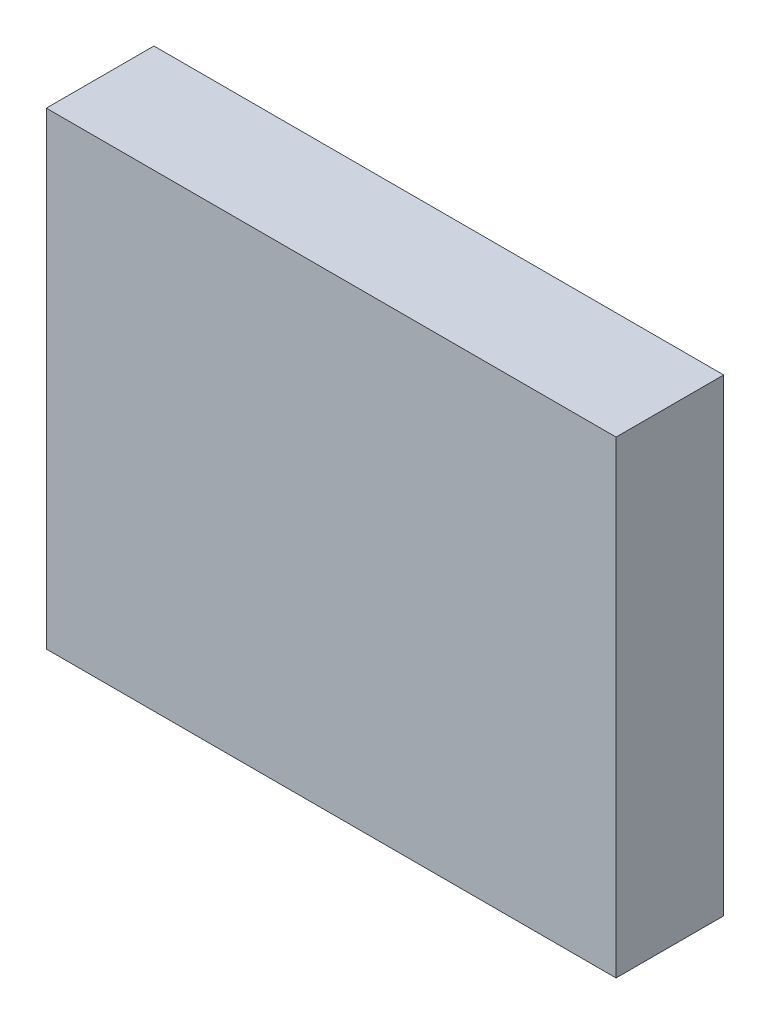
ISO-10303-21;
HEADER;
FILE_DESCRIPTION(('STEP AP214'),'2;1');
FILE_NAME('part.step','',(''),(''),'','','');
FILE_SCHEMA(('AUTOMOTIVE_DESIGN { 1 0 10303 214 1 1 1 1 }'));
ENDSEC;
DATA;
#1=APPLICATION_CONTEXT('core data for automotive mechanical design processes');
#2=APPLICATION_PROTOCOL_DEFINITION('international standard','automotive_design',2000,#1);
#3=PRODUCT_CONTEXT('',#1,'mechanical');
#4=PRODUCT('Part','Part','',(#3));
#5=PRODUCT_RELATED_PRODUCT_CATEGORY('part','',(#4));
#6=PRODUCT_DEFINITION_FORMATION('','',#4);
#7=PRODUCT_DEFINITION_CONTEXT('part definition',#1,'design');
#8=PRODUCT_DEFINITION('design','',#6,#7);
#9=PRODUCT_DEFINITION_SHAPE('','',#8);
#10=(LENGTH_UNIT() NAMED_UNIT(*) SI_UNIT(.MILLI.,.METRE.));
#11=(NAMED_UNIT(*) PLANE_ANGLE_UNIT() SI_UNIT($,.RADIAN.));
#12=(NAMED_UNIT(*) SI_UNIT($,.STERADIAN.) SOLID_ANGLE_UNIT());
#13=UNCERTAINTY_MEASURE_WITH_UNIT(LENGTH_MEASURE(1.E-05),#10,'distance_accuracy_value','');
#14=(GEOMETRIC_REPRESENTATION_CONTEXT(3) GLOBAL_UNCERTAINTY_ASSIGNED_CONTEXT((#13)) GLOBAL_UNIT_ASSIGNED_CONTEXT((#10,
#11,#12)) REPRESENTATION_CONTEXT('',''));
#15=CARTESIAN_POINT('',(0.,0.,0.));
#16=DIRECTION('',(0.,0.,1.));
#17=DIRECTION('',(1.,0.,0.));
#18=AXIS2_PLACEMENT_3D('',#15,#16,#17);
#19=CARTESIAN_POINT('',(0.,0.,8.5));
#20=DIRECTION('',(-1.,0.,0.));
#21=DIRECTION('',(0.,0.,1.));
#22=AXIS2_PLACEMENT_3D('',#19,#20,#21);
#23=PLANE('',#22);
#24=DIRECTION('',(0.,1.,0.));
#25=VECTOR('',#24,1.);
#26=CARTESIAN_POINT('',(0.,0.,0.));
#27=LINE('',#26,#25);
#28=CARTESIAN_POINT('',(0.,0.,0.));
#29=VERTEX_POINT('',#28);
#30=CARTESIAN_POINT('',(0.,37.,0.));
#31=VERTEX_POINT('',#30);
#32=EDGE_CURVE('E101',#29,#31,#27,.T.);
#33=ORIENTED_EDGE('',*,*,#32,.F.);
#34=DIRECTION('',(0.,0.,-1.));
#35=VECTOR('',#34,1.);
#36=CARTESIAN_POINT('',(0.,0.,8.5));
#37=LINE('',#36,#35);
#38=CARTESIAN_POINT('',(0.,0.,8.5));
#39=VERTEX_POINT('',#38);
#40=EDGE_CURVE('E11',#39,#29,#37,.T.);
#41=ORIENTED_EDGE('',*,*,#40,.F.);
#42=DIRECTION('',(0.,1.,0.));
#43=VECTOR('',#42,1.);
#44=CARTESIAN_POINT('',(0.,0.,8.5));
#45=LINE('',#44,#43);
#46=CARTESIAN_POINT('',(0.,37.,8.5));
#47=VERTEX_POINT('',#46);
#48=EDGE_CURVE('E96',#39,#47,#45,.T.);
#49=ORIENTED_EDGE('',*,*,#48,.T.);
#50=DIRECTION('',(0.,0.,-1.));
#51=VECTOR('',#50,1.);
#52=CARTESIAN_POINT('',(0.,37.,8.5));
#53=LINE('',#52,#51);
#54=EDGE_CURVE('E39',#47,#31,#53,.T.);
#55=ORIENTED_EDGE('',*,*,#54,.T.);
#56=EDGE_LOOP('',(#33,#41,#49,#55));
#57=FACE_BOUND('',#56,.T.);
#58=ADVANCED_FACE('F36',(#57),#23,.T.);
#59=CARTESIAN_POINT('',(0.,0.,8.5));
#60=DIRECTION('',(0.,1.,0.));
#61=DIRECTION('',(0.,0.,1.));
#62=AXIS2_PLACEMENT_3D('',#59,#60,#61);
#63=PLANE('',#62);
#64=DIRECTION('',(1.,0.,0.));
#65=VECTOR('',#64,1.);
#66=CARTESIAN_POINT('',(0.,0.,0.));
#67=LINE('',#66,#65);
#68=CARTESIAN_POINT('',(45.,0.,0.));
#69=VERTEX_POINT('',#68);
#70=EDGE_CURVE('E69',#29,#69,#67,.T.);
#71=ORIENTED_EDGE('',*,*,#70,.T.);
#72=DIRECTION('',(0.,0.,-1.));
#73=VECTOR('',#72,1.);
#74=CARTESIAN_POINT('',(45.,0.,8.5));
#75=LINE('',#74,#73);
#76=CARTESIAN_POINT('',(45.,0.,8.5));
#77=VERTEX_POINT('',#76);
#78=EDGE_CURVE('E45',#77,#69,#75,.T.);
#79=ORIENTED_EDGE('',*,*,#78,.F.);
#80=DIRECTION('',(1.,0.,0.));
#81=VECTOR('',#80,1.);
#82=CARTESIAN_POINT('',(0.,0.,8.5));
#83=LINE('',#82,#81);
#84=EDGE_CURVE('E86',#39,#77,#83,.T.);
#85=ORIENTED_EDGE('',*,*,#84,.F.);
#86=ORIENTED_EDGE('',*,*,#40,.T.);
#87=EDGE_LOOP('',(#71,#79,#85,#86));
#88=FACE_BOUND('',#87,.T.);
#89=ADVANCED_FACE('F111',(#88),#63,.F.);
#90=CARTESIAN_POINT('',(45.,0.,8.5));
#91=DIRECTION('',(-1.,0.,0.));
#92=DIRECTION('',(0.,0.,1.));
#93=AXIS2_PLACEMENT_3D('',#90,#91,#92);
#94=PLANE('',#93);
#95=DIRECTION('',(0.,1.,0.));
#96=VECTOR('',#95,1.);
#97=CARTESIAN_POINT('',(45.,0.,0.));
#98=LINE('',#97,#96);
#99=CARTESIAN_POINT('',(45.,37.,0.));
#100=VERTEX_POINT('',#99);
#101=EDGE_CURVE('E93',#69,#100,#98,.T.);
#102=ORIENTED_EDGE('',*,*,#101,.T.);
#103=DIRECTION('',(0.,0.,-1.));
#104=VECTOR('',#103,1.);
#105=CARTESIAN_POINT('',(45.,37.,8.5));
#106=LINE('',#105,#104);
#107=CARTESIAN_POINT('',(45.,37.,8.5));
#108=VERTEX_POINT('',#107);
#109=EDGE_CURVE('E90',#108,#100,#106,.T.);
#110=ORIENTED_EDGE('',*,*,#109,.F.);
#111=DIRECTION('',(0.,1.,0.));
#112=VECTOR('',#111,1.);
#113=CARTESIAN_POINT('',(45.,0.,8.5));
#114=LINE('',#113,#112);
#115=EDGE_CURVE('E81',#77,#108,#114,.T.);
#116=ORIENTED_EDGE('',*,*,#115,.F.);
#117=ORIENTED_EDGE('',*,*,#78,.T.);
#118=EDGE_LOOP('',(#102,#110,#116,#117));
#119=FACE_BOUND('',#118,.T.);
#120=ADVANCED_FACE('F91',(#119),#94,.F.);
#121=CARTESIAN_POINT('',(0.,37.,8.5));
#122=DIRECTION('',(0.,1.,0.));
#123=DIRECTION('',(0.,0.,1.));
#124=AXIS2_PLACEMENT_3D('',#121,#122,#123);
#125=PLANE('',#124);
#126=DIRECTION('',(1.,0.,0.));
#127=VECTOR('',#126,1.);
#128=CARTESIAN_POINT('',(0.,37.,0.));
#129=LINE('',#128,#127);
#130=EDGE_CURVE('E104',#31,#100,#129,.T.);
#131=ORIENTED_EDGE('',*,*,#130,.F.);
#132=ORIENTED_EDGE('',*,*,#54,.F.);
#133=DIRECTION('',(1.,0.,0.));
#134=VECTOR('',#133,1.);
#135=CARTESIAN_POINT('',(0.,37.,8.5));
#136=LINE('',#135,#134);
#137=EDGE_CURVE('E85',#47,#108,#136,.T.);
#138=ORIENTED_EDGE('',*,*,#137,.T.);
#139=ORIENTED_EDGE('',*,*,#109,.T.);
#140=EDGE_LOOP('',(#131,#132,#138,#139));
#141=FACE_BOUND('',#140,.T.);
#142=ADVANCED_FACE('F95',(#141),#125,.T.);
#143=CARTESIAN_POINT('',(0.,0.,8.5));
#144=DIRECTION('',(0.,0.,-1.));
#145=DIRECTION('',(-1.,0.,0.));
#146=AXIS2_PLACEMENT_3D('',#143,#144,#145);
#147=PLANE('',#146);
#148=ORIENTED_EDGE('',*,*,#48,.F.);
#149=ORIENTED_EDGE('',*,*,#84,.T.);
#150=ORIENTED_EDGE('',*,*,#115,.T.);
#151=ORIENTED_EDGE('',*,*,#137,.F.);
#152=EDGE_LOOP('',(#148,#149,#150,#151));
#153=FACE_BOUND('',#152,.T.);
#154=ADVANCED_FACE('F84',(#153),#147,.F.);
#155=CARTESIAN_POINT('',(0.,0.,0.));
#156=DIRECTION('',(0.,0.,-1.));
#157=DIRECTION('',(-1.,0.,0.));
#158=AXIS2_PLACEMENT_3D('',#155,#156,#157);
#159=PLANE('',#158);
#160=ORIENTED_EDGE('',*,*,#32,.T.);
#161=ORIENTED_EDGE('',*,*,#130,.T.);
#162=ORIENTED_EDGE('',*,*,#101,.F.);
#163=ORIENTED_EDGE('',*,*,#70,.F.);
#164=EDGE_LOOP('',(#160,#161,#162,#163));
#165=FACE_BOUND('',#164,.T.);
#166=ADVANCED_FACE('F109',(#165),#159,.T.);
#167=CLOSED_SHELL('',(#58,#89,#120,#142,#154,#166));
#168=MANIFOLD_SOLID_BREP('B2',#167);
#169=ADVANCED_BREP_SHAPE_REPRESENTATION('',(#18,#168),#14);
#170=SHAPE_DEFINITION_REPRESENTATION(#9,#169);
ENDSEC;
END-ISO-10303-21;
